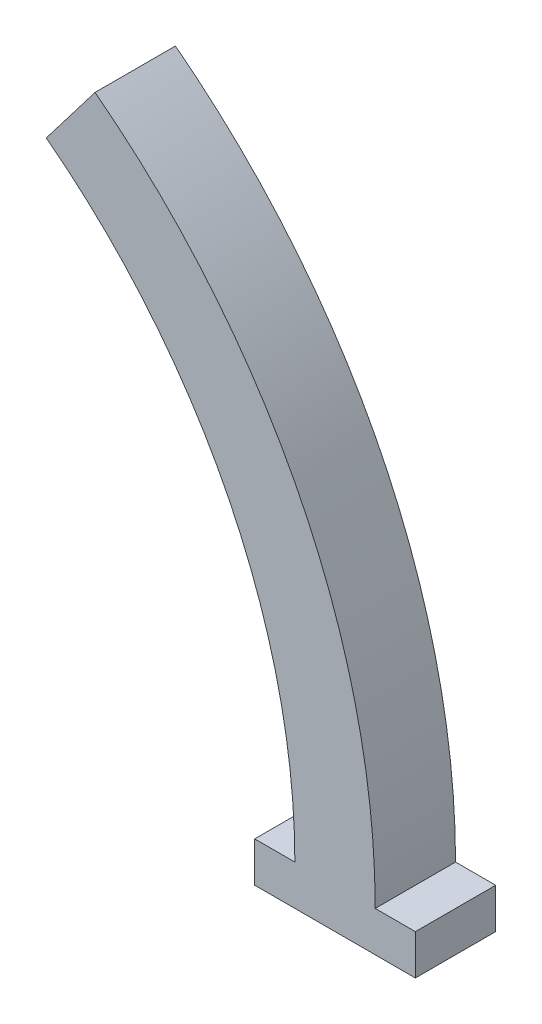
ISO-10303-21;
HEADER;
FILE_DESCRIPTION(('STEP AP214'),'2;1');
FILE_NAME('part.step','',(''),(''),'','','');
FILE_SCHEMA(('AUTOMOTIVE_DESIGN { 1 0 10303 214 1 1 1 1 }'));
ENDSEC;
DATA;
#1=APPLICATION_CONTEXT('core data for automotive mechanical design processes');
#2=APPLICATION_PROTOCOL_DEFINITION('international standard','automotive_design',2000,#1);
#3=PRODUCT_CONTEXT('',#1,'mechanical');
#4=PRODUCT('Part','Part','',(#3));
#5=PRODUCT_RELATED_PRODUCT_CATEGORY('part','',(#4));
#6=PRODUCT_DEFINITION_FORMATION('','',#4);
#7=PRODUCT_DEFINITION_CONTEXT('part definition',#1,'design');
#8=PRODUCT_DEFINITION('design','',#6,#7);
#9=PRODUCT_DEFINITION_SHAPE('','',#8);
#10=(LENGTH_UNIT() NAMED_UNIT(*) SI_UNIT(.MILLI.,.METRE.));
#11=(NAMED_UNIT(*) PLANE_ANGLE_UNIT() SI_UNIT($,.RADIAN.));
#12=(NAMED_UNIT(*) SI_UNIT($,.STERADIAN.) SOLID_ANGLE_UNIT());
#13=UNCERTAINTY_MEASURE_WITH_UNIT(LENGTH_MEASURE(1.E-05),#10,'distance_accuracy_value','');
#14=(GEOMETRIC_REPRESENTATION_CONTEXT(3) GLOBAL_UNCERTAINTY_ASSIGNED_CONTEXT((#13)) GLOBAL_UNIT_ASSIGNED_CONTEXT((#10,
#11,#12)) REPRESENTATION_CONTEXT('',''));
#15=CARTESIAN_POINT('',(0.,0.,0.));
#16=DIRECTION('',(0.,0.,1.));
#17=DIRECTION('',(1.,0.,0.));
#18=AXIS2_PLACEMENT_3D('',#15,#16,#17);
#19=CARTESIAN_POINT('',(0.,2.54,0.));
#20=DIRECTION('',(0.,-1.,0.));
#21=DIRECTION('',(0.,0.,-1.));
#22=AXIS2_PLACEMENT_3D('',#19,#20,#21);
#23=PLANE('',#22);
#24=DIRECTION('',(0.,0.,1.));
#25=VECTOR('',#24,1.);
#26=CARTESIAN_POINT('',(2.54,2.54000000000001,-5.08));
#27=LINE('',#26,#25);
#28=CARTESIAN_POINT('',(2.54,2.54000000000001,-5.08));
#29=VERTEX_POINT('',#28);
#30=CARTESIAN_POINT('',(2.54,2.54000000000001,0.));
#31=VERTEX_POINT('',#30);
#32=EDGE_CURVE('E131',#29,#31,#27,.T.);
#33=ORIENTED_EDGE('',*,*,#32,.F.);
#34=DIRECTION('',(-1.,0.,0.));
#35=VECTOR('',#34,1.);
#36=CARTESIAN_POINT('',(0.,2.54,-5.08));
#37=LINE('',#36,#35);
#38=CARTESIAN_POINT('',(0.,2.54,-5.08));
#39=VERTEX_POINT('',#38);
#40=EDGE_CURVE('E59',#29,#39,#37,.T.);
#41=ORIENTED_EDGE('',*,*,#40,.T.);
#42=DIRECTION('',(0.,0.,1.));
#43=VECTOR('',#42,1.);
#44=CARTESIAN_POINT('',(0.,2.54,0.));
#45=LINE('',#44,#43);
#46=CARTESIAN_POINT('',(0.,2.54,0.));
#47=VERTEX_POINT('',#46);
#48=EDGE_CURVE('E142',#39,#47,#45,.T.);
#49=ORIENTED_EDGE('',*,*,#48,.T.);
#50=DIRECTION('',(1.,0.,0.));
#51=VECTOR('',#50,1.);
#52=CARTESIAN_POINT('',(0.,2.54,0.));
#53=LINE('',#52,#51);
#54=EDGE_CURVE('E88',#47,#31,#53,.T.);
#55=ORIENTED_EDGE('',*,*,#54,.T.);
#56=EDGE_LOOP('',(#33,#41,#49,#55));
#57=FACE_BOUND('',#56,.T.);
#58=ADVANCED_FACE('F35',(#57),#23,.F.);
#59=CARTESIAN_POINT('',(0.,2.54,0.));
#60=DIRECTION('',(1.,0.,0.));
#61=DIRECTION('',(0.,0.,-1.));
#62=AXIS2_PLACEMENT_3D('',#59,#60,#61);
#63=PLANE('',#62);
#64=DIRECTION('',(0.,0.,1.));
#65=VECTOR('',#64,1.);
#66=CARTESIAN_POINT('',(0.,0.,0.));
#67=LINE('',#66,#65);
#68=CARTESIAN_POINT('',(0.,0.,-5.08));
#69=VERTEX_POINT('',#68);
#70=CARTESIAN_POINT('',(0.,0.,0.));
#71=VERTEX_POINT('',#70);
#72=EDGE_CURVE('E125',#69,#71,#67,.T.);
#73=ORIENTED_EDGE('',*,*,#72,.T.);
#74=DIRECTION('',(0.,-1.,0.));
#75=VECTOR('',#74,1.);
#76=CARTESIAN_POINT('',(0.,2.54,0.));
#77=LINE('',#76,#75);
#78=EDGE_CURVE('E11',#47,#71,#77,.T.);
#79=ORIENTED_EDGE('',*,*,#78,.F.);
#80=ORIENTED_EDGE('',*,*,#48,.F.);
#81=DIRECTION('',(0.,-1.,0.));
#82=VECTOR('',#81,1.);
#83=CARTESIAN_POINT('',(0.,2.54,-5.08));
#84=LINE('',#83,#82);
#85=EDGE_CURVE('E151',#39,#69,#84,.T.);
#86=ORIENTED_EDGE('',*,*,#85,.T.);
#87=EDGE_LOOP('',(#73,#79,#80,#86));
#88=FACE_BOUND('',#87,.T.);
#89=ADVANCED_FACE('F37',(#88),#63,.F.);
#90=CARTESIAN_POINT('',(0.,2.54,0.));
#91=DIRECTION('',(0.,0.,-1.));
#92=DIRECTION('',(-1.,0.,0.));
#93=AXIS2_PLACEMENT_3D('',#90,#91,#92);
#94=PLANE('',#93);
#95=DIRECTION('',(1.,0.,0.));
#96=VECTOR('',#95,1.);
#97=CARTESIAN_POINT('',(0.,0.,0.));
#98=LINE('',#97,#96);
#99=CARTESIAN_POINT('',(10.16,0.,0.));
#100=VERTEX_POINT('',#99);
#101=EDGE_CURVE('E154',#71,#100,#98,.T.);
#102=ORIENTED_EDGE('',*,*,#101,.T.);
#103=DIRECTION('',(0.,-1.,0.));
#104=VECTOR('',#103,1.);
#105=CARTESIAN_POINT('',(10.16,2.54,0.));
#106=LINE('',#105,#104);
#107=CARTESIAN_POINT('',(10.16,2.54,0.));
#108=VERTEX_POINT('',#107);
#109=EDGE_CURVE('E43',#108,#100,#106,.T.);
#110=ORIENTED_EDGE('',*,*,#109,.F.);
#111=CARTESIAN_POINT('',(7.62,2.54,0.));
#112=VERTEX_POINT('',#111);
#113=EDGE_CURVE('E144',#112,#108,#53,.T.);
#114=ORIENTED_EDGE('',*,*,#113,.F.);
#115=CARTESIAN_POINT('',(-37.4876668777866,2.54,0.));
#116=DIRECTION('',(0.,0.,1.));
#117=DIRECTION('',(1.,0.,0.));
#118=AXIS2_PLACEMENT_3D('',#115,#116,#117);
#119=CIRCLE('',#118,45.1076668777866);
#120=CARTESIAN_POINT('',(-10.0953437561406,38.378000016138,0.));
#121=VERTEX_POINT('',#120);
#122=EDGE_CURVE('E50',#112,#121,#119,.T.);
#123=ORIENTED_EDGE('',*,*,#122,.T.);
#124=DIRECTION('',(-0.607265350164572,-0.794499084007968,0.));
#125=VECTOR('',#124,1.);
#126=CARTESIAN_POINT('',(-10.0953437561406,38.378000016138,0.));
#127=LINE('',#126,#125);
#128=CARTESIAN_POINT('',(-13.1802517349767,34.3419446693775,0.));
#129=VERTEX_POINT('',#128);
#130=EDGE_CURVE('E135',#121,#129,#127,.T.);
#131=ORIENTED_EDGE('',*,*,#130,.T.);
#132=CARTESIAN_POINT('',(-37.4876668777866,2.54,0.));
#133=DIRECTION('',(0.,0.,-1.));
#134=DIRECTION('',(-1.,0.,0.));
#135=AXIS2_PLACEMENT_3D('',#132,#133,#134);
#136=CIRCLE('',#135,40.0276668777866);
#137=EDGE_CURVE('E121',#31,#129,#136,.F.);
#138=ORIENTED_EDGE('',*,*,#137,.F.);
#139=ORIENTED_EDGE('',*,*,#54,.F.);
#140=ORIENTED_EDGE('',*,*,#78,.T.);
#141=EDGE_LOOP('',(#102,#110,#114,#123,#131,#138,#139,#140));
#142=FACE_BOUND('',#141,.T.);
#143=ADVANCED_FACE('F175',(#142),#94,.F.);
#144=CARTESIAN_POINT('',(10.16,2.54,0.));
#145=DIRECTION('',(-1.,0.,0.));
#146=DIRECTION('',(0.,0.,1.));
#147=AXIS2_PLACEMENT_3D('',#144,#145,#146);
#148=PLANE('',#147);
#149=DIRECTION('',(0.,0.,-1.));
#150=VECTOR('',#149,1.);
#151=CARTESIAN_POINT('',(10.16,0.,0.));
#152=LINE('',#151,#150);
#153=CARTESIAN_POINT('',(10.16,0.,-5.08));
#154=VERTEX_POINT('',#153);
#155=EDGE_CURVE('E156',#100,#154,#152,.T.);
#156=ORIENTED_EDGE('',*,*,#155,.T.);
#157=DIRECTION('',(0.,-1.,0.));
#158=VECTOR('',#157,1.);
#159=CARTESIAN_POINT('',(10.16,2.54,-5.08));
#160=LINE('',#159,#158);
#161=CARTESIAN_POINT('',(10.16,2.54,-5.08));
#162=VERTEX_POINT('',#161);
#163=EDGE_CURVE('E160',#162,#154,#160,.T.);
#164=ORIENTED_EDGE('',*,*,#163,.F.);
#165=DIRECTION('',(0.,0.,-1.));
#166=VECTOR('',#165,1.);
#167=CARTESIAN_POINT('',(10.16,2.54,0.));
#168=LINE('',#167,#166);
#169=EDGE_CURVE('E146',#108,#162,#168,.T.);
#170=ORIENTED_EDGE('',*,*,#169,.F.);
#171=ORIENTED_EDGE('',*,*,#109,.T.);
#172=EDGE_LOOP('',(#156,#164,#170,#171));
#173=FACE_BOUND('',#172,.T.);
#174=ADVANCED_FACE('F166',(#173),#148,.F.);
#175=CARTESIAN_POINT('',(0.,2.54,-5.08));
#176=DIRECTION('',(0.,0.,1.));
#177=DIRECTION('',(1.,0.,0.));
#178=AXIS2_PLACEMENT_3D('',#175,#176,#177);
#179=PLANE('',#178);
#180=DIRECTION('',(-1.,0.,0.));
#181=VECTOR('',#180,1.);
#182=CARTESIAN_POINT('',(0.,0.,-5.08));
#183=LINE('',#182,#181);
#184=EDGE_CURVE('E81',#154,#69,#183,.T.);
#185=ORIENTED_EDGE('',*,*,#184,.T.);
#186=ORIENTED_EDGE('',*,*,#85,.F.);
#187=ORIENTED_EDGE('',*,*,#40,.F.);
#188=CARTESIAN_POINT('',(-37.4876668777866,2.54,-5.08));
#189=DIRECTION('',(0.,0.,-1.));
#190=DIRECTION('',(-1.,0.,0.));
#191=AXIS2_PLACEMENT_3D('',#188,#189,#190);
#192=CIRCLE('',#191,40.0276668777866);
#193=CARTESIAN_POINT('',(-13.1802517349767,34.3419446693775,-5.08));
#194=VERTEX_POINT('',#193);
#195=EDGE_CURVE('E109',#29,#194,#192,.F.);
#196=ORIENTED_EDGE('',*,*,#195,.T.);
#197=DIRECTION('',(-0.607265350164572,-0.794499084007968,0.));
#198=VECTOR('',#197,1.);
#199=CARTESIAN_POINT('',(-10.0953437561406,38.378000016138,-5.08));
#200=LINE('',#199,#198);
#201=CARTESIAN_POINT('',(-10.0953437561406,38.378000016138,-5.08));
#202=VERTEX_POINT('',#201);
#203=EDGE_CURVE('E114',#202,#194,#200,.T.);
#204=ORIENTED_EDGE('',*,*,#203,.F.);
#205=CARTESIAN_POINT('',(-37.4876668777866,2.54,-5.08));
#206=DIRECTION('',(0.,0.,1.));
#207=DIRECTION('',(1.,0.,0.));
#208=AXIS2_PLACEMENT_3D('',#205,#206,#207);
#209=CIRCLE('',#208,45.1076668777866);
#210=CARTESIAN_POINT('',(7.62,2.54,-5.08));
#211=VERTEX_POINT('',#210);
#212=EDGE_CURVE('E129',#211,#202,#209,.T.);
#213=ORIENTED_EDGE('',*,*,#212,.F.);
#214=EDGE_CURVE('E148',#162,#211,#37,.T.);
#215=ORIENTED_EDGE('',*,*,#214,.F.);
#216=ORIENTED_EDGE('',*,*,#163,.T.);
#217=EDGE_LOOP('',(#185,#186,#187,#196,#204,#213,#215,#216));
#218=FACE_BOUND('',#217,.T.);
#219=ADVANCED_FACE('F111',(#218),#179,.F.);
#220=ORIENTED_EDGE('',*,*,#214,.T.);
#221=DIRECTION('',(0.,0.,1.));
#222=VECTOR('',#221,1.);
#223=CARTESIAN_POINT('',(7.62,2.54,-5.08));
#224=LINE('',#223,#222);
#225=EDGE_CURVE('E139',#211,#112,#224,.T.);
#226=ORIENTED_EDGE('',*,*,#225,.T.);
#227=ORIENTED_EDGE('',*,*,#113,.T.);
#228=ORIENTED_EDGE('',*,*,#169,.T.);
#229=EDGE_LOOP('',(#220,#226,#227,#228));
#230=FACE_BOUND('',#229,.T.);
#231=ADVANCED_FACE('F177',(#230),#23,.F.);
#232=CARTESIAN_POINT('',(0.,0.,0.));
#233=DIRECTION('',(0.,-1.,0.));
#234=DIRECTION('',(0.,0.,-1.));
#235=AXIS2_PLACEMENT_3D('',#232,#233,#234);
#236=PLANE('',#235);
#237=ORIENTED_EDGE('',*,*,#72,.F.);
#238=ORIENTED_EDGE('',*,*,#184,.F.);
#239=ORIENTED_EDGE('',*,*,#155,.F.);
#240=ORIENTED_EDGE('',*,*,#101,.F.);
#241=EDGE_LOOP('',(#237,#238,#239,#240));
#242=FACE_BOUND('',#241,.T.);
#243=ADVANCED_FACE('F171',(#242),#236,.T.);
#244=CARTESIAN_POINT('',(-37.4876668777866,2.54,-5.08));
#245=DIRECTION('',(0.,0.,1.));
#246=DIRECTION('',(1.,0.,0.));
#247=AXIS2_PLACEMENT_3D('',#244,#245,#246);
#248=CYLINDRICAL_SURFACE('',#247,40.0276668777866);
#249=ORIENTED_EDGE('',*,*,#137,.T.);
#250=DIRECTION('',(0.,0.,1.));
#251=VECTOR('',#250,1.);
#252=CARTESIAN_POINT('',(-13.1802517349767,34.3419446693775,-5.08));
#253=LINE('',#252,#251);
#254=EDGE_CURVE('E119',#194,#129,#253,.T.);
#255=ORIENTED_EDGE('',*,*,#254,.F.);
#256=ORIENTED_EDGE('',*,*,#195,.F.);
#257=ORIENTED_EDGE('',*,*,#32,.T.);
#258=EDGE_LOOP('',(#249,#255,#256,#257));
#259=FACE_BOUND('',#258,.T.);
#260=ADVANCED_FACE('F120',(#259),#248,.F.);
#261=CARTESIAN_POINT('',(-10.0953437561406,38.378000016138,-5.08));
#262=DIRECTION('',(-0.794499084007968,0.607265350164572,0.));
#263=DIRECTION('',(-0.607265350164572,-0.794499084007968,0.));
#264=AXIS2_PLACEMENT_3D('',#261,#262,#263);
#265=PLANE('',#264);
#266=ORIENTED_EDGE('',*,*,#130,.F.);
#267=DIRECTION('',(0.,0.,1.));
#268=VECTOR('',#267,1.);
#269=CARTESIAN_POINT('',(-10.0953437561406,38.378000016138,-5.08));
#270=LINE('',#269,#268);
#271=EDGE_CURVE('E126',#202,#121,#270,.T.);
#272=ORIENTED_EDGE('',*,*,#271,.F.);
#273=ORIENTED_EDGE('',*,*,#203,.T.);
#274=ORIENTED_EDGE('',*,*,#254,.T.);
#275=EDGE_LOOP('',(#266,#272,#273,#274));
#276=FACE_BOUND('',#275,.T.);
#277=ADVANCED_FACE('F128',(#276),#265,.T.);
#278=CARTESIAN_POINT('',(-37.4876668777866,2.54,-5.08));
#279=DIRECTION('',(0.,0.,1.));
#280=DIRECTION('',(1.,0.,0.));
#281=AXIS2_PLACEMENT_3D('',#278,#279,#280);
#282=CYLINDRICAL_SURFACE('',#281,45.1076668777866);
#283=ORIENTED_EDGE('',*,*,#122,.F.);
#284=ORIENTED_EDGE('',*,*,#225,.F.);
#285=ORIENTED_EDGE('',*,*,#212,.T.);
#286=ORIENTED_EDGE('',*,*,#271,.T.);
#287=EDGE_LOOP('',(#283,#284,#285,#286));
#288=FACE_BOUND('',#287,.T.);
#289=ADVANCED_FACE('F179',(#288),#282,.T.);
#290=CLOSED_SHELL('',(#58,#89,#143,#174,#219,#231,#243,#260,#277,#289));
#291=MANIFOLD_SOLID_BREP('B2',#290);
#292=ADVANCED_BREP_SHAPE_REPRESENTATION('',(#18,#291),#14);
#293=SHAPE_DEFINITION_REPRESENTATION(#9,#292);
ENDSEC;
END-ISO-10303-21;
